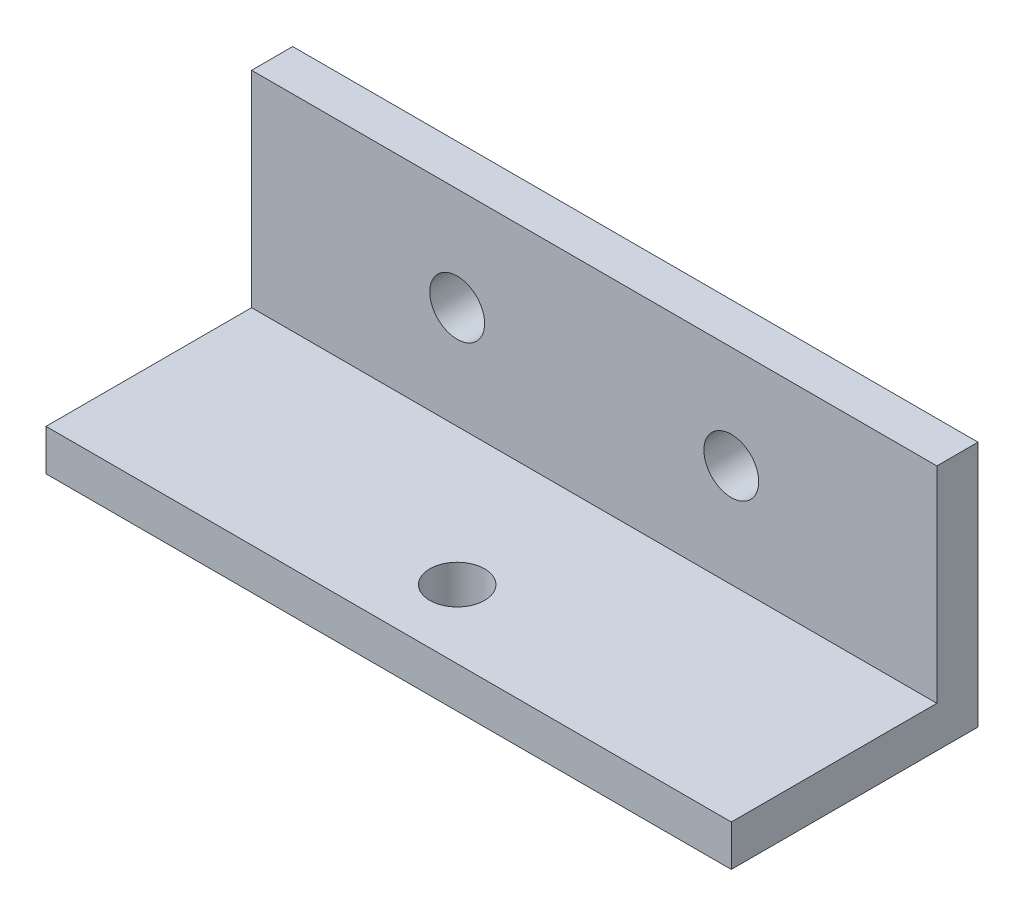
ISO-10303-21;
HEADER;
FILE_DESCRIPTION(('STEP AP214'),'2;1');
FILE_NAME('part.step','',(''),(''),'','','');
FILE_SCHEMA(('AUTOMOTIVE_DESIGN { 1 0 10303 214 1 1 1 1 }'));
ENDSEC;
DATA;
#1=APPLICATION_CONTEXT('core data for automotive mechanical design processes');
#2=APPLICATION_PROTOCOL_DEFINITION('international standard','automotive_design',2000,#1);
#3=PRODUCT_CONTEXT('',#1,'mechanical');
#4=PRODUCT('Part','Part','',(#3));
#5=PRODUCT_RELATED_PRODUCT_CATEGORY('part','',(#4));
#6=PRODUCT_DEFINITION_FORMATION('','',#4);
#7=PRODUCT_DEFINITION_CONTEXT('part definition',#1,'design');
#8=PRODUCT_DEFINITION('design','',#6,#7);
#9=PRODUCT_DEFINITION_SHAPE('','',#8);
#10=(LENGTH_UNIT() NAMED_UNIT(*) SI_UNIT(.MILLI.,.METRE.));
#11=(NAMED_UNIT(*) PLANE_ANGLE_UNIT() SI_UNIT($,.RADIAN.));
#12=(NAMED_UNIT(*) SI_UNIT($,.STERADIAN.) SOLID_ANGLE_UNIT());
#13=UNCERTAINTY_MEASURE_WITH_UNIT(LENGTH_MEASURE(1.E-05),#10,'distance_accuracy_value','');
#14=(GEOMETRIC_REPRESENTATION_CONTEXT(3) GLOBAL_UNCERTAINTY_ASSIGNED_CONTEXT((#13)) GLOBAL_UNIT_ASSIGNED_CONTEXT((#10,
#11,#12)) REPRESENTATION_CONTEXT('',''));
#15=CARTESIAN_POINT('',(0.,0.,0.));
#16=DIRECTION('',(0.,0.,1.));
#17=DIRECTION('',(1.,0.,0.));
#18=AXIS2_PLACEMENT_3D('',#15,#16,#17);
#19=CARTESIAN_POINT('',(0.,3.,0.));
#20=DIRECTION('',(0.,-1.,0.));
#21=DIRECTION('',(0.,0.,-1.));
#22=AXIS2_PLACEMENT_3D('',#19,#20,#21);
#23=PLANE('',#22);
#24=DIRECTION('',(0.,0.,-1.));
#25=VECTOR('',#24,1.);
#26=CARTESIAN_POINT('',(25.,3.,7.5));
#27=LINE('',#26,#25);
#28=CARTESIAN_POINT('',(25.,3.,7.5));
#29=VERTEX_POINT('',#28);
#30=CARTESIAN_POINT('',(25.,3.,-7.5));
#31=VERTEX_POINT('',#30);
#32=EDGE_CURVE('E95',#29,#31,#27,.T.);
#33=ORIENTED_EDGE('',*,*,#32,.T.);
#34=DIRECTION('',(-1.,0.,0.));
#35=VECTOR('',#34,1.);
#36=CARTESIAN_POINT('',(-25.,3.,-7.5));
#37=LINE('',#36,#35);
#38=CARTESIAN_POINT('',(-25.,3.,-7.5));
#39=VERTEX_POINT('',#38);
#40=EDGE_CURVE('E71',#31,#39,#37,.T.);
#41=ORIENTED_EDGE('',*,*,#40,.T.);
#42=DIRECTION('',(0.,0.,1.));
#43=VECTOR('',#42,1.);
#44=CARTESIAN_POINT('',(-25.,3.,7.5));
#45=LINE('',#44,#43);
#46=CARTESIAN_POINT('',(-25.,3.,7.5));
#47=VERTEX_POINT('',#46);
#48=EDGE_CURVE('E93',#39,#47,#45,.T.);
#49=ORIENTED_EDGE('',*,*,#48,.T.);
#50=DIRECTION('',(1.,0.,0.));
#51=VECTOR('',#50,1.);
#52=CARTESIAN_POINT('',(-25.,3.,7.5));
#53=LINE('',#52,#51);
#54=EDGE_CURVE('E50',#47,#29,#53,.T.);
#55=ORIENTED_EDGE('',*,*,#54,.T.);
#56=EDGE_LOOP('',(#33,#41,#49,#55));
#57=FACE_BOUND('',#56,.T.);
#58=CARTESIAN_POINT('',(0.,3.,2.5));
#59=DIRECTION('',(0.,1.,0.));
#60=DIRECTION('',(0.,0.,1.));
#61=AXIS2_PLACEMENT_3D('',#58,#59,#60);
#62=CIRCLE('',#61,2.);
#63=CARTESIAN_POINT('',(0.,3.,4.5));
#64=VERTEX_POINT('',#63);
#65=EDGE_CURVE('E105',#64,#64,#62,.T.);
#66=ORIENTED_EDGE('',*,*,#65,.F.);
#67=EDGE_LOOP('',(#66));
#68=FACE_BOUND('',#67,.T.);
#69=ADVANCED_FACE('F33',(#57,#68),#23,.F.);
#70=CARTESIAN_POINT('',(0.,0.,0.));
#71=DIRECTION('',(0.,-1.,0.));
#72=DIRECTION('',(0.,0.,-1.));
#73=AXIS2_PLACEMENT_3D('',#70,#71,#72);
#74=PLANE('',#73);
#75=DIRECTION('',(0.,0.,-1.));
#76=VECTOR('',#75,1.);
#77=CARTESIAN_POINT('',(25.,0.,7.5));
#78=LINE('',#77,#76);
#79=CARTESIAN_POINT('',(25.,0.,7.5));
#80=VERTEX_POINT('',#79);
#81=CARTESIAN_POINT('',(25.,0.,-10.5));
#82=VERTEX_POINT('',#81);
#83=EDGE_CURVE('E102',#80,#82,#78,.T.);
#84=ORIENTED_EDGE('',*,*,#83,.F.);
#85=DIRECTION('',(1.,0.,0.));
#86=VECTOR('',#85,1.);
#87=CARTESIAN_POINT('',(-25.,0.,7.5));
#88=LINE('',#87,#86);
#89=CARTESIAN_POINT('',(-25.,0.,7.5));
#90=VERTEX_POINT('',#89);
#91=EDGE_CURVE('E107',#90,#80,#88,.T.);
#92=ORIENTED_EDGE('',*,*,#91,.F.);
#93=DIRECTION('',(0.,0.,1.));
#94=VECTOR('',#93,1.);
#95=CARTESIAN_POINT('',(-25.,0.,7.5));
#96=LINE('',#95,#94);
#97=CARTESIAN_POINT('',(-25.,0.,-10.5));
#98=VERTEX_POINT('',#97);
#99=EDGE_CURVE('E62',#98,#90,#96,.T.);
#100=ORIENTED_EDGE('',*,*,#99,.F.);
#101=DIRECTION('',(1.,0.,0.));
#102=VECTOR('',#101,1.);
#103=CARTESIAN_POINT('',(25.,0.,-10.5));
#104=LINE('',#103,#102);
#105=EDGE_CURVE('E119',#98,#82,#104,.T.);
#106=ORIENTED_EDGE('',*,*,#105,.T.);
#107=EDGE_LOOP('',(#84,#92,#100,#106));
#108=FACE_BOUND('',#107,.T.);
#109=CARTESIAN_POINT('',(0.,0.,2.5));
#110=DIRECTION('',(0.,1.,0.));
#111=DIRECTION('',(0.,0.,1.));
#112=AXIS2_PLACEMENT_3D('',#109,#110,#111);
#113=CIRCLE('',#112,2.);
#114=CARTESIAN_POINT('',(0.,0.,4.5));
#115=VERTEX_POINT('',#114);
#116=EDGE_CURVE('E138',#115,#115,#113,.T.);
#117=ORIENTED_EDGE('',*,*,#116,.T.);
#118=EDGE_LOOP('',(#117));
#119=FACE_BOUND('',#118,.T.);
#120=ADVANCED_FACE('F116',(#108,#119),#74,.T.);
#121=CARTESIAN_POINT('',(25.,3.,7.5));
#122=DIRECTION('',(-1.,0.,0.));
#123=DIRECTION('',(0.,0.,1.));
#124=AXIS2_PLACEMENT_3D('',#121,#122,#123);
#125=PLANE('',#124);
#126=ORIENTED_EDGE('',*,*,#83,.T.);
#127=DIRECTION('',(0.,-1.,0.));
#128=VECTOR('',#127,1.);
#129=CARTESIAN_POINT('',(25.,18.,-10.5));
#130=LINE('',#129,#128);
#131=CARTESIAN_POINT('',(25.,18.,-10.5));
#132=VERTEX_POINT('',#131);
#133=EDGE_CURVE('E136',#132,#82,#130,.T.);
#134=ORIENTED_EDGE('',*,*,#133,.F.);
#135=DIRECTION('',(0.,0.,1.));
#136=VECTOR('',#135,1.);
#137=CARTESIAN_POINT('',(25.,18.,-7.5));
#138=LINE('',#137,#136);
#139=CARTESIAN_POINT('',(25.,18.,-7.5));
#140=VERTEX_POINT('',#139);
#141=EDGE_CURVE('E124',#132,#140,#138,.T.);
#142=ORIENTED_EDGE('',*,*,#141,.T.);
#143=DIRECTION('',(0.,-1.,0.));
#144=VECTOR('',#143,1.);
#145=CARTESIAN_POINT('',(25.,18.,-7.5));
#146=LINE('',#145,#144);
#147=EDGE_CURVE('E90',#140,#31,#146,.T.);
#148=ORIENTED_EDGE('',*,*,#147,.T.);
#149=ORIENTED_EDGE('',*,*,#32,.F.);
#150=DIRECTION('',(0.,-1.,0.));
#151=VECTOR('',#150,1.);
#152=CARTESIAN_POINT('',(25.,3.,7.5));
#153=LINE('',#152,#151);
#154=EDGE_CURVE('E42',#29,#80,#153,.T.);
#155=ORIENTED_EDGE('',*,*,#154,.T.);
#156=EDGE_LOOP('',(#126,#134,#142,#148,#149,#155));
#157=FACE_BOUND('',#156,.T.);
#158=ADVANCED_FACE('F35',(#157),#125,.F.);
#159=CARTESIAN_POINT('',(-25.,3.,7.5));
#160=DIRECTION('',(1.,0.,0.));
#161=DIRECTION('',(0.,0.,-1.));
#162=AXIS2_PLACEMENT_3D('',#159,#160,#161);
#163=PLANE('',#162);
#164=ORIENTED_EDGE('',*,*,#99,.T.);
#165=DIRECTION('',(0.,-1.,0.));
#166=VECTOR('',#165,1.);
#167=CARTESIAN_POINT('',(-25.,3.,7.5));
#168=LINE('',#167,#166);
#169=EDGE_CURVE('E11',#47,#90,#168,.T.);
#170=ORIENTED_EDGE('',*,*,#169,.F.);
#171=ORIENTED_EDGE('',*,*,#48,.F.);
#172=DIRECTION('',(0.,-1.,0.));
#173=VECTOR('',#172,1.);
#174=CARTESIAN_POINT('',(-25.,18.,-7.50000000000001));
#175=LINE('',#174,#173);
#176=CARTESIAN_POINT('',(-25.,18.,-7.50000000000001));
#177=VERTEX_POINT('',#176);
#178=EDGE_CURVE('E81',#177,#39,#175,.T.);
#179=ORIENTED_EDGE('',*,*,#178,.F.);
#180=DIRECTION('',(0.,0.,-1.));
#181=VECTOR('',#180,1.);
#182=CARTESIAN_POINT('',(-25.,18.,-7.50000000000001));
#183=LINE('',#182,#181);
#184=CARTESIAN_POINT('',(-25.,18.,-10.5));
#185=VERTEX_POINT('',#184);
#186=EDGE_CURVE('E265',#177,#185,#183,.T.);
#187=ORIENTED_EDGE('',*,*,#186,.T.);
#188=DIRECTION('',(0.,-1.,0.));
#189=VECTOR('',#188,1.);
#190=CARTESIAN_POINT('',(-25.,18.,-10.5));
#191=LINE('',#190,#189);
#192=EDGE_CURVE('E89',#185,#98,#191,.T.);
#193=ORIENTED_EDGE('',*,*,#192,.T.);
#194=EDGE_LOOP('',(#164,#170,#171,#179,#187,#193));
#195=FACE_BOUND('',#194,.T.);
#196=ADVANCED_FACE('F97',(#195),#163,.F.);
#197=CARTESIAN_POINT('',(-25.,3.,7.5));
#198=DIRECTION('',(0.,0.,-1.));
#199=DIRECTION('',(-1.,0.,0.));
#200=AXIS2_PLACEMENT_3D('',#197,#198,#199);
#201=PLANE('',#200);
#202=ORIENTED_EDGE('',*,*,#91,.T.);
#203=ORIENTED_EDGE('',*,*,#154,.F.);
#204=ORIENTED_EDGE('',*,*,#54,.F.);
#205=ORIENTED_EDGE('',*,*,#169,.T.);
#206=EDGE_LOOP('',(#202,#203,#204,#205));
#207=FACE_BOUND('',#206,.T.);
#208=ADVANCED_FACE('F148',(#207),#201,.F.);
#209=CARTESIAN_POINT('',(0.,3.,2.5));
#210=DIRECTION('',(0.,-1.,0.));
#211=DIRECTION('',(0.,0.,-1.));
#212=AXIS2_PLACEMENT_3D('',#209,#210,#211);
#213=CYLINDRICAL_SURFACE('',#212,2.);
#214=ORIENTED_EDGE('',*,*,#65,.T.);
#215=EDGE_LOOP('',(#214));
#216=FACE_BOUND('',#215,.T.);
#217=ORIENTED_EDGE('',*,*,#116,.F.);
#218=EDGE_LOOP('',(#217));
#219=FACE_BOUND('',#218,.T.);
#220=ADVANCED_FACE('F146',(#216,#219),#213,.F.);
#221=CARTESIAN_POINT('',(25.,18.,-7.5));
#222=DIRECTION('',(0.,0.,1.));
#223=DIRECTION('',(1.,0.,0.));
#224=AXIS2_PLACEMENT_3D('',#221,#222,#223);
#225=PLANE('',#224);
#226=CARTESIAN_POINT('',(-10.,10.5,-7.5));
#227=DIRECTION('',(0.,0.,1.));
#228=DIRECTION('',(1.,0.,0.));
#229=AXIS2_PLACEMENT_3D('',#226,#227,#228);
#230=CIRCLE('',#229,2.);
#231=CARTESIAN_POINT('',(-8.,10.5,-7.5));
#232=VERTEX_POINT('',#231);
#233=EDGE_CURVE('E130',#232,#232,#230,.T.);
#234=ORIENTED_EDGE('',*,*,#233,.F.);
#235=EDGE_LOOP('',(#234));
#236=FACE_BOUND('',#235,.T.);
#237=CARTESIAN_POINT('',(10.,10.5,-7.5));
#238=DIRECTION('',(0.,0.,1.));
#239=DIRECTION('',(-1.,0.,0.));
#240=AXIS2_PLACEMENT_3D('',#237,#238,#239);
#241=CIRCLE('',#240,2.);
#242=CARTESIAN_POINT('',(8.,10.5,-7.5));
#243=VERTEX_POINT('',#242);
#244=EDGE_CURVE('E260',#243,#243,#241,.T.);
#245=ORIENTED_EDGE('',*,*,#244,.F.);
#246=EDGE_LOOP('',(#245));
#247=FACE_BOUND('',#246,.T.);
#248=ORIENTED_EDGE('',*,*,#40,.F.);
#249=ORIENTED_EDGE('',*,*,#147,.F.);
#250=DIRECTION('',(-1.,0.,0.));
#251=VECTOR('',#250,1.);
#252=CARTESIAN_POINT('',(25.,18.,-7.5));
#253=LINE('',#252,#251);
#254=EDGE_CURVE('E85',#140,#177,#253,.T.);
#255=ORIENTED_EDGE('',*,*,#254,.T.);
#256=ORIENTED_EDGE('',*,*,#178,.T.);
#257=EDGE_LOOP('',(#248,#249,#255,#256));
#258=FACE_BOUND('',#257,.T.);
#259=ADVANCED_FACE('F82',(#236,#247,#258),#225,.T.);
#260=CARTESIAN_POINT('',(25.,18.,-10.5));
#261=DIRECTION('',(0.,0.,-1.));
#262=DIRECTION('',(-1.,0.,0.));
#263=AXIS2_PLACEMENT_3D('',#260,#261,#262);
#264=PLANE('',#263);
#265=CARTESIAN_POINT('',(-10.,10.5,-10.5));
#266=DIRECTION('',(0.,0.,1.));
#267=DIRECTION('',(1.,0.,0.));
#268=AXIS2_PLACEMENT_3D('',#265,#266,#267);
#269=CIRCLE('',#268,2.);
#270=CARTESIAN_POINT('',(-8.,10.5,-10.5));
#271=VERTEX_POINT('',#270);
#272=EDGE_CURVE('E125',#271,#271,#269,.T.);
#273=ORIENTED_EDGE('',*,*,#272,.T.);
#274=EDGE_LOOP('',(#273));
#275=FACE_BOUND('',#274,.T.);
#276=CARTESIAN_POINT('',(10.,10.5,-10.5));
#277=DIRECTION('',(0.,0.,1.));
#278=DIRECTION('',(-1.,0.,0.));
#279=AXIS2_PLACEMENT_3D('',#276,#277,#278);
#280=CIRCLE('',#279,2.);
#281=CARTESIAN_POINT('',(8.,10.5,-10.5));
#282=VERTEX_POINT('',#281);
#283=EDGE_CURVE('E257',#282,#282,#280,.T.);
#284=ORIENTED_EDGE('',*,*,#283,.T.);
#285=EDGE_LOOP('',(#284));
#286=FACE_BOUND('',#285,.T.);
#287=ORIENTED_EDGE('',*,*,#105,.F.);
#288=ORIENTED_EDGE('',*,*,#192,.F.);
#289=DIRECTION('',(1.,0.,0.));
#290=VECTOR('',#289,1.);
#291=CARTESIAN_POINT('',(25.,18.,-10.5));
#292=LINE('',#291,#290);
#293=EDGE_CURVE('E134',#185,#132,#292,.T.);
#294=ORIENTED_EDGE('',*,*,#293,.T.);
#295=ORIENTED_EDGE('',*,*,#133,.T.);
#296=EDGE_LOOP('',(#287,#288,#294,#295));
#297=FACE_BOUND('',#296,.T.);
#298=ADVANCED_FACE('F155',(#275,#286,#297),#264,.T.);
#299=CARTESIAN_POINT('',(0.,18.,0.));
#300=DIRECTION('',(0.,1.,0.));
#301=DIRECTION('',(0.,0.,1.));
#302=AXIS2_PLACEMENT_3D('',#299,#300,#301);
#303=PLANE('',#302);
#304=ORIENTED_EDGE('',*,*,#141,.F.);
#305=ORIENTED_EDGE('',*,*,#293,.F.);
#306=ORIENTED_EDGE('',*,*,#186,.F.);
#307=ORIENTED_EDGE('',*,*,#254,.F.);
#308=EDGE_LOOP('',(#304,#305,#306,#307));
#309=FACE_BOUND('',#308,.T.);
#310=ADVANCED_FACE('F220',(#309),#303,.T.);
#311=CARTESIAN_POINT('',(10.,10.5,-10.5));
#312=DIRECTION('',(0.,0.,1.));
#313=DIRECTION('',(1.,0.,0.));
#314=AXIS2_PLACEMENT_3D('',#311,#312,#313);
#315=CYLINDRICAL_SURFACE('',#314,2.);
#316=ORIENTED_EDGE('',*,*,#283,.F.);
#317=EDGE_LOOP('',(#316));
#318=FACE_BOUND('',#317,.T.);
#319=ORIENTED_EDGE('',*,*,#244,.T.);
#320=EDGE_LOOP('',(#319));
#321=FACE_BOUND('',#320,.T.);
#322=ADVANCED_FACE('F229',(#318,#321),#315,.F.);
#323=CARTESIAN_POINT('',(-10.,10.5,-10.5));
#324=DIRECTION('',(0.,0.,1.));
#325=DIRECTION('',(1.,0.,0.));
#326=AXIS2_PLACEMENT_3D('',#323,#324,#325);
#327=CYLINDRICAL_SURFACE('',#326,2.);
#328=ORIENTED_EDGE('',*,*,#272,.F.);
#329=EDGE_LOOP('',(#328));
#330=FACE_BOUND('',#329,.T.);
#331=ORIENTED_EDGE('',*,*,#233,.T.);
#332=EDGE_LOOP('',(#331));
#333=FACE_BOUND('',#332,.T.);
#334=ADVANCED_FACE('F237',(#330,#333),#327,.F.);
#335=CLOSED_SHELL('',(#69,#120,#158,#196,#208,#220,#259,#298,#310,#322,#334));
#336=MANIFOLD_SOLID_BREP('B2',#335);
#337=ADVANCED_BREP_SHAPE_REPRESENTATION('',(#18,#336),#14);
#338=SHAPE_DEFINITION_REPRESENTATION(#9,#337);
ENDSEC;
END-ISO-10303-21;
